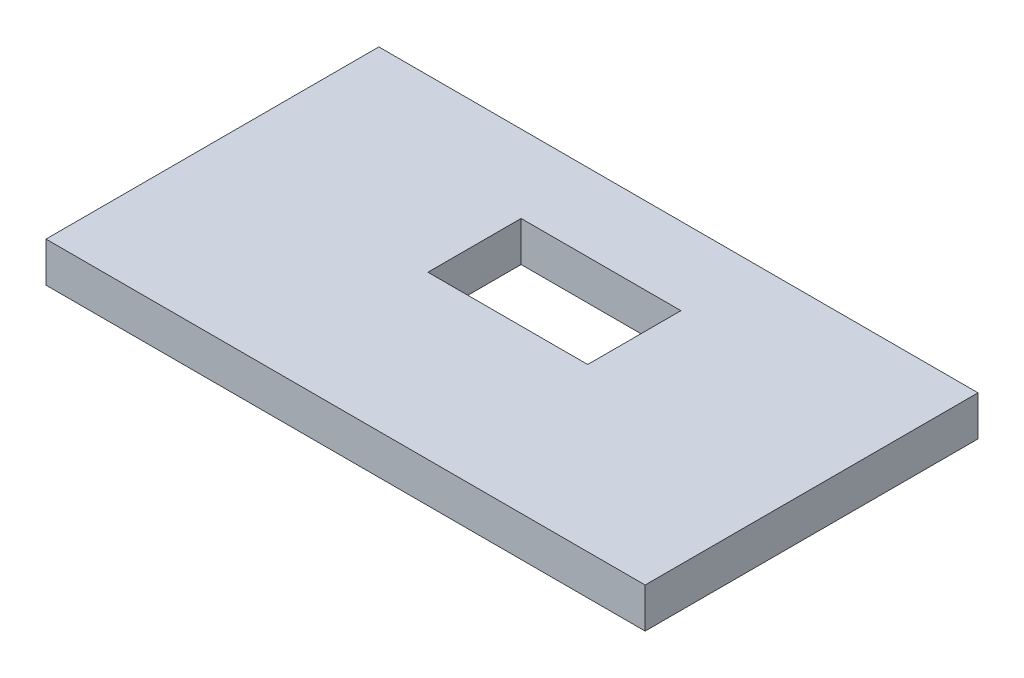
ISO-10303-21;
HEADER;
FILE_DESCRIPTION(('STEP AP214'),'2;1');
FILE_NAME('part.step','',(''),(''),'','','');
FILE_SCHEMA(('AUTOMOTIVE_DESIGN { 1 0 10303 214 1 1 1 1 }'));
ENDSEC;
DATA;
#1=APPLICATION_CONTEXT('core data for automotive mechanical design processes');
#2=APPLICATION_PROTOCOL_DEFINITION('international standard','automotive_design',2000,#1);
#3=PRODUCT_CONTEXT('',#1,'mechanical');
#4=PRODUCT('Part','Part','',(#3));
#5=PRODUCT_RELATED_PRODUCT_CATEGORY('part','',(#4));
#6=PRODUCT_DEFINITION_FORMATION('','',#4);
#7=PRODUCT_DEFINITION_CONTEXT('part definition',#1,'design');
#8=PRODUCT_DEFINITION('design','',#6,#7);
#9=PRODUCT_DEFINITION_SHAPE('','',#8);
#10=(LENGTH_UNIT() NAMED_UNIT(*) SI_UNIT(.MILLI.,.METRE.));
#11=(NAMED_UNIT(*) PLANE_ANGLE_UNIT() SI_UNIT($,.RADIAN.));
#12=(NAMED_UNIT(*) SI_UNIT($,.STERADIAN.) SOLID_ANGLE_UNIT());
#13=UNCERTAINTY_MEASURE_WITH_UNIT(LENGTH_MEASURE(1.E-05),#10,'distance_accuracy_value','');
#14=(GEOMETRIC_REPRESENTATION_CONTEXT(3) GLOBAL_UNCERTAINTY_ASSIGNED_CONTEXT((#13)) GLOBAL_UNIT_ASSIGNED_CONTEXT((#10,
#11,#12)) REPRESENTATION_CONTEXT('',''));
#15=CARTESIAN_POINT('',(0.,0.,0.));
#16=DIRECTION('',(0.,0.,1.));
#17=DIRECTION('',(1.,0.,0.));
#18=AXIS2_PLACEMENT_3D('',#15,#16,#17);
#19=CARTESIAN_POINT('',(0.,3.,0.));
#20=DIRECTION('',(1.,0.,0.));
#21=DIRECTION('',(0.,0.,-1.));
#22=AXIS2_PLACEMENT_3D('',#19,#20,#21);
#23=PLANE('',#22);
#24=DIRECTION('',(0.,0.,1.));
#25=VECTOR('',#24,1.);
#26=CARTESIAN_POINT('',(0.,0.,0.));
#27=LINE('',#26,#25);
#28=CARTESIAN_POINT('',(0.,0.,-25.));
#29=VERTEX_POINT('',#28);
#30=CARTESIAN_POINT('',(0.,0.,0.));
#31=VERTEX_POINT('',#30);
#32=EDGE_CURVE('E131',#29,#31,#27,.T.);
#33=ORIENTED_EDGE('',*,*,#32,.T.);
#34=DIRECTION('',(0.,-1.,0.));
#35=VECTOR('',#34,1.);
#36=CARTESIAN_POINT('',(0.,3.,0.));
#37=LINE('',#36,#35);
#38=CARTESIAN_POINT('',(0.,3.,0.));
#39=VERTEX_POINT('',#38);
#40=EDGE_CURVE('E11',#39,#31,#37,.T.);
#41=ORIENTED_EDGE('',*,*,#40,.F.);
#42=DIRECTION('',(0.,0.,1.));
#43=VECTOR('',#42,1.);
#44=CARTESIAN_POINT('',(0.,3.,0.));
#45=LINE('',#44,#43);
#46=CARTESIAN_POINT('',(0.,3.,-25.));
#47=VERTEX_POINT('',#46);
#48=EDGE_CURVE('E135',#47,#39,#45,.T.);
#49=ORIENTED_EDGE('',*,*,#48,.F.);
#50=DIRECTION('',(0.,-1.,0.));
#51=VECTOR('',#50,1.);
#52=CARTESIAN_POINT('',(0.,3.,-25.));
#53=LINE('',#52,#51);
#54=EDGE_CURVE('E145',#47,#29,#53,.T.);
#55=ORIENTED_EDGE('',*,*,#54,.T.);
#56=EDGE_LOOP('',(#33,#41,#49,#55));
#57=FACE_BOUND('',#56,.T.);
#58=ADVANCED_FACE('F34',(#57),#23,.F.);
#59=CARTESIAN_POINT('',(0.,3.,0.));
#60=DIRECTION('',(0.,0.,-1.));
#61=DIRECTION('',(-1.,0.,0.));
#62=AXIS2_PLACEMENT_3D('',#59,#60,#61);
#63=PLANE('',#62);
#64=DIRECTION('',(1.,0.,0.));
#65=VECTOR('',#64,1.);
#66=CARTESIAN_POINT('',(0.,0.,0.));
#67=LINE('',#66,#65);
#68=CARTESIAN_POINT('',(45.,0.,0.));
#69=VERTEX_POINT('',#68);
#70=EDGE_CURVE('E148',#31,#69,#67,.T.);
#71=ORIENTED_EDGE('',*,*,#70,.T.);
#72=DIRECTION('',(0.,-1.,0.));
#73=VECTOR('',#72,1.);
#74=CARTESIAN_POINT('',(45.,3.,0.));
#75=LINE('',#74,#73);
#76=CARTESIAN_POINT('',(45.,3.,0.));
#77=VERTEX_POINT('',#76);
#78=EDGE_CURVE('E41',#77,#69,#75,.T.);
#79=ORIENTED_EDGE('',*,*,#78,.F.);
#80=DIRECTION('',(1.,0.,0.));
#81=VECTOR('',#80,1.);
#82=CARTESIAN_POINT('',(0.,3.,0.));
#83=LINE('',#82,#81);
#84=EDGE_CURVE('E138',#39,#77,#83,.T.);
#85=ORIENTED_EDGE('',*,*,#84,.F.);
#86=ORIENTED_EDGE('',*,*,#40,.T.);
#87=EDGE_LOOP('',(#71,#79,#85,#86));
#88=FACE_BOUND('',#87,.T.);
#89=ADVANCED_FACE('F176',(#88),#63,.F.);
#90=CARTESIAN_POINT('',(45.,3.,0.));
#91=DIRECTION('',(-1.,0.,0.));
#92=DIRECTION('',(0.,0.,1.));
#93=AXIS2_PLACEMENT_3D('',#90,#91,#92);
#94=PLANE('',#93);
#95=DIRECTION('',(0.,0.,-1.));
#96=VECTOR('',#95,1.);
#97=CARTESIAN_POINT('',(45.,0.,0.));
#98=LINE('',#97,#96);
#99=CARTESIAN_POINT('',(45.,0.,-25.));
#100=VERTEX_POINT('',#99);
#101=EDGE_CURVE('E150',#69,#100,#98,.T.);
#102=ORIENTED_EDGE('',*,*,#101,.T.);
#103=DIRECTION('',(0.,-1.,0.));
#104=VECTOR('',#103,1.);
#105=CARTESIAN_POINT('',(45.,3.,-25.));
#106=LINE('',#105,#104);
#107=CARTESIAN_POINT('',(45.,3.,-25.));
#108=VERTEX_POINT('',#107);
#109=EDGE_CURVE('E155',#108,#100,#106,.T.);
#110=ORIENTED_EDGE('',*,*,#109,.F.);
#111=DIRECTION('',(0.,0.,-1.));
#112=VECTOR('',#111,1.);
#113=CARTESIAN_POINT('',(45.,3.,0.));
#114=LINE('',#113,#112);
#115=EDGE_CURVE('E141',#77,#108,#114,.T.);
#116=ORIENTED_EDGE('',*,*,#115,.F.);
#117=ORIENTED_EDGE('',*,*,#78,.T.);
#118=EDGE_LOOP('',(#102,#110,#116,#117));
#119=FACE_BOUND('',#118,.T.);
#120=ADVANCED_FACE('F162',(#119),#94,.F.);
#121=CARTESIAN_POINT('',(0.,3.,-25.));
#122=DIRECTION('',(0.,0.,1.));
#123=DIRECTION('',(1.,0.,0.));
#124=AXIS2_PLACEMENT_3D('',#121,#122,#123);
#125=PLANE('',#124);
#126=DIRECTION('',(-1.,0.,0.));
#127=VECTOR('',#126,1.);
#128=CARTESIAN_POINT('',(0.,0.,-25.));
#129=LINE('',#128,#127);
#130=EDGE_CURVE('E139',#100,#29,#129,.T.);
#131=ORIENTED_EDGE('',*,*,#130,.T.);
#132=ORIENTED_EDGE('',*,*,#54,.F.);
#133=DIRECTION('',(-1.,0.,0.));
#134=VECTOR('',#133,1.);
#135=CARTESIAN_POINT('',(0.,3.,-25.));
#136=LINE('',#135,#134);
#137=EDGE_CURVE('E143',#108,#47,#136,.T.);
#138=ORIENTED_EDGE('',*,*,#137,.F.);
#139=ORIENTED_EDGE('',*,*,#109,.T.);
#140=EDGE_LOOP('',(#131,#132,#138,#139));
#141=FACE_BOUND('',#140,.T.);
#142=ADVANCED_FACE('F171',(#141),#125,.F.);
#143=CARTESIAN_POINT('',(0.,3.,0.));
#144=DIRECTION('',(0.,-1.,0.));
#145=DIRECTION('',(0.,0.,-1.));
#146=AXIS2_PLACEMENT_3D('',#143,#144,#145);
#147=PLANE('',#146);
#148=DIRECTION('',(-1.,0.,0.));
#149=VECTOR('',#148,1.);
#150=CARTESIAN_POINT('',(16.5,3.,-12.1848193530788));
#151=LINE('',#150,#149);
#152=CARTESIAN_POINT('',(28.5,3.,-12.1848193530788));
#153=VERTEX_POINT('',#152);
#154=CARTESIAN_POINT('',(16.5,3.,-12.1848193530788));
#155=VERTEX_POINT('',#154);
#156=EDGE_CURVE('E106',#153,#155,#151,.T.);
#157=ORIENTED_EDGE('',*,*,#156,.T.);
#158=DIRECTION('',(0.,0.,-1.));
#159=VECTOR('',#158,1.);
#160=CARTESIAN_POINT('',(16.5,3.,-19.1848193530788));
#161=LINE('',#160,#159);
#162=CARTESIAN_POINT('',(16.5,3.,-19.1848193530788));
#163=VERTEX_POINT('',#162);
#164=EDGE_CURVE('E100',#155,#163,#161,.T.);
#165=ORIENTED_EDGE('',*,*,#164,.T.);
#166=DIRECTION('',(1.,0.,0.));
#167=VECTOR('',#166,1.);
#168=CARTESIAN_POINT('',(16.5,3.,-19.1848193530788));
#169=LINE('',#168,#167);
#170=CARTESIAN_POINT('',(28.5,3.,-19.1848193530788));
#171=VERTEX_POINT('',#170);
#172=EDGE_CURVE('E109',#163,#171,#169,.T.);
#173=ORIENTED_EDGE('',*,*,#172,.T.);
#174=DIRECTION('',(0.,0.,1.));
#175=VECTOR('',#174,1.);
#176=CARTESIAN_POINT('',(28.5,3.,-19.1848193530788));
#177=LINE('',#176,#175);
#178=EDGE_CURVE('E48',#171,#153,#177,.T.);
#179=ORIENTED_EDGE('',*,*,#178,.T.);
#180=EDGE_LOOP('',(#157,#165,#173,#179));
#181=FACE_BOUND('',#180,.T.);
#182=ORIENTED_EDGE('',*,*,#48,.T.);
#183=ORIENTED_EDGE('',*,*,#84,.T.);
#184=ORIENTED_EDGE('',*,*,#115,.T.);
#185=ORIENTED_EDGE('',*,*,#137,.T.);
#186=EDGE_LOOP('',(#182,#183,#184,#185));
#187=FACE_BOUND('',#186,.T.);
#188=ADVANCED_FACE('F113',(#181,#187),#147,.F.);
#189=CARTESIAN_POINT('',(0.,0.,0.));
#190=DIRECTION('',(0.,-1.,0.));
#191=DIRECTION('',(0.,0.,-1.));
#192=AXIS2_PLACEMENT_3D('',#189,#190,#191);
#193=PLANE('',#192);
#194=DIRECTION('',(0.,0.,-1.));
#195=VECTOR('',#194,1.);
#196=CARTESIAN_POINT('',(16.5,0.,-19.1848193530788));
#197=LINE('',#196,#195);
#198=CARTESIAN_POINT('',(16.5,0.,-12.1848193530788));
#199=VERTEX_POINT('',#198);
#200=CARTESIAN_POINT('',(16.5,0.,-19.1848193530788));
#201=VERTEX_POINT('',#200);
#202=EDGE_CURVE('E56',#199,#201,#197,.T.);
#203=ORIENTED_EDGE('',*,*,#202,.F.);
#204=DIRECTION('',(-1.,0.,0.));
#205=VECTOR('',#204,1.);
#206=CARTESIAN_POINT('',(16.5,0.,-12.1848193530788));
#207=LINE('',#206,#205);
#208=CARTESIAN_POINT('',(28.5,0.,-12.1848193530788));
#209=VERTEX_POINT('',#208);
#210=EDGE_CURVE('E116',#209,#199,#207,.T.);
#211=ORIENTED_EDGE('',*,*,#210,.F.);
#212=DIRECTION('',(0.,0.,1.));
#213=VECTOR('',#212,1.);
#214=CARTESIAN_POINT('',(28.5,0.,-19.1848193530788));
#215=LINE('',#214,#213);
#216=CARTESIAN_POINT('',(28.5,0.,-19.1848193530788));
#217=VERTEX_POINT('',#216);
#218=EDGE_CURVE('E119',#217,#209,#215,.T.);
#219=ORIENTED_EDGE('',*,*,#218,.F.);
#220=DIRECTION('',(1.,0.,0.));
#221=VECTOR('',#220,1.);
#222=CARTESIAN_POINT('',(16.5,0.,-19.1848193530788));
#223=LINE('',#222,#221);
#224=EDGE_CURVE('E125',#201,#217,#223,.T.);
#225=ORIENTED_EDGE('',*,*,#224,.F.);
#226=EDGE_LOOP('',(#203,#211,#219,#225));
#227=FACE_BOUND('',#226,.T.);
#228=ORIENTED_EDGE('',*,*,#32,.F.);
#229=ORIENTED_EDGE('',*,*,#130,.F.);
#230=ORIENTED_EDGE('',*,*,#101,.F.);
#231=ORIENTED_EDGE('',*,*,#70,.F.);
#232=EDGE_LOOP('',(#228,#229,#230,#231));
#233=FACE_BOUND('',#232,.T.);
#234=ADVANCED_FACE('F168',(#227,#233),#193,.T.);
#235=CARTESIAN_POINT('',(16.5,3.,-19.1848193530788));
#236=DIRECTION('',(-1.,0.,0.));
#237=DIRECTION('',(0.,0.,1.));
#238=AXIS2_PLACEMENT_3D('',#235,#236,#237);
#239=PLANE('',#238);
#240=ORIENTED_EDGE('',*,*,#202,.T.);
#241=DIRECTION('',(0.,-1.,0.));
#242=VECTOR('',#241,1.);
#243=CARTESIAN_POINT('',(16.5,3.,-19.1848193530788));
#244=LINE('',#243,#242);
#245=EDGE_CURVE('E96',#163,#201,#244,.T.);
#246=ORIENTED_EDGE('',*,*,#245,.F.);
#247=ORIENTED_EDGE('',*,*,#164,.F.);
#248=DIRECTION('',(0.,-1.,0.));
#249=VECTOR('',#248,1.);
#250=CARTESIAN_POINT('',(16.5,3.,-12.1848193530788));
#251=LINE('',#250,#249);
#252=EDGE_CURVE('E129',#155,#199,#251,.T.);
#253=ORIENTED_EDGE('',*,*,#252,.T.);
#254=EDGE_LOOP('',(#240,#246,#247,#253));
#255=FACE_BOUND('',#254,.T.);
#256=ADVANCED_FACE('F98',(#255),#239,.F.);
#257=CARTESIAN_POINT('',(16.5,3.,-12.1848193530788));
#258=DIRECTION('',(0.,0.,1.));
#259=DIRECTION('',(1.,0.,0.));
#260=AXIS2_PLACEMENT_3D('',#257,#258,#259);
#261=PLANE('',#260);
#262=ORIENTED_EDGE('',*,*,#210,.T.);
#263=ORIENTED_EDGE('',*,*,#252,.F.);
#264=ORIENTED_EDGE('',*,*,#156,.F.);
#265=DIRECTION('',(0.,-1.,0.));
#266=VECTOR('',#265,1.);
#267=CARTESIAN_POINT('',(28.5,3.,-12.1848193530788));
#268=LINE('',#267,#266);
#269=EDGE_CURVE('E132',#153,#209,#268,.T.);
#270=ORIENTED_EDGE('',*,*,#269,.T.);
#271=EDGE_LOOP('',(#262,#263,#264,#270));
#272=FACE_BOUND('',#271,.T.);
#273=ADVANCED_FACE('F193',(#272),#261,.F.);
#274=CARTESIAN_POINT('',(28.5,3.,-19.1848193530788));
#275=DIRECTION('',(1.,0.,0.));
#276=DIRECTION('',(0.,0.,-1.));
#277=AXIS2_PLACEMENT_3D('',#274,#275,#276);
#278=PLANE('',#277);
#279=ORIENTED_EDGE('',*,*,#218,.T.);
#280=ORIENTED_EDGE('',*,*,#269,.F.);
#281=ORIENTED_EDGE('',*,*,#178,.F.);
#282=DIRECTION('',(0.,-1.,0.));
#283=VECTOR('',#282,1.);
#284=CARTESIAN_POINT('',(28.5,3.,-19.1848193530788));
#285=LINE('',#284,#283);
#286=EDGE_CURVE('E105',#171,#217,#285,.T.);
#287=ORIENTED_EDGE('',*,*,#286,.T.);
#288=EDGE_LOOP('',(#279,#280,#281,#287));
#289=FACE_BOUND('',#288,.T.);
#290=ADVANCED_FACE('F196',(#289),#278,.F.);
#291=CARTESIAN_POINT('',(16.5,3.,-19.1848193530788));
#292=DIRECTION('',(0.,0.,-1.));
#293=DIRECTION('',(-1.,0.,0.));
#294=AXIS2_PLACEMENT_3D('',#291,#292,#293);
#295=PLANE('',#294);
#296=ORIENTED_EDGE('',*,*,#224,.T.);
#297=ORIENTED_EDGE('',*,*,#286,.F.);
#298=ORIENTED_EDGE('',*,*,#172,.F.);
#299=ORIENTED_EDGE('',*,*,#245,.T.);
#300=EDGE_LOOP('',(#296,#297,#298,#299));
#301=FACE_BOUND('',#300,.T.);
#302=ADVANCED_FACE('F110',(#301),#295,.F.);
#303=CLOSED_SHELL('',(#58,#89,#120,#142,#188,#234,#256,#273,#290,#302));
#304=MANIFOLD_SOLID_BREP('B2',#303);
#305=ADVANCED_BREP_SHAPE_REPRESENTATION('',(#18,#304),#14);
#306=SHAPE_DEFINITION_REPRESENTATION(#9,#305);
ENDSEC;
END-ISO-10303-21;
